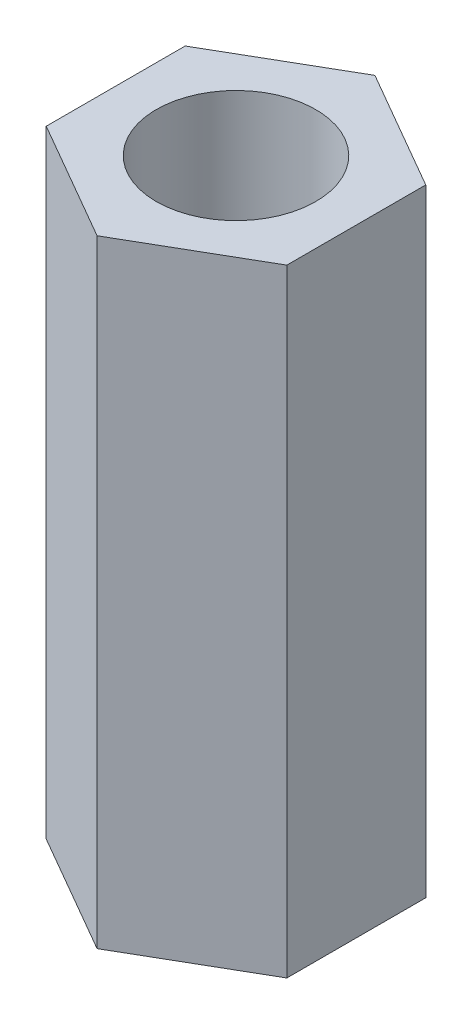
ISO-10303-21;
HEADER;
FILE_DESCRIPTION(('STEP AP214'),'2;1');
FILE_NAME('part.step','',(''),(''),'','','');
FILE_SCHEMA(('AUTOMOTIVE_DESIGN { 1 0 10303 214 1 1 1 1 }'));
ENDSEC;
DATA;
#1=APPLICATION_CONTEXT('core data for automotive mechanical design processes');
#2=APPLICATION_PROTOCOL_DEFINITION('international standard','automotive_design',2000,#1);
#3=PRODUCT_CONTEXT('',#1,'mechanical');
#4=PRODUCT('Part','Part','',(#3));
#5=PRODUCT_RELATED_PRODUCT_CATEGORY('part','',(#4));
#6=PRODUCT_DEFINITION_FORMATION('','',#4);
#7=PRODUCT_DEFINITION_CONTEXT('part definition',#1,'design');
#8=PRODUCT_DEFINITION('design','',#6,#7);
#9=PRODUCT_DEFINITION_SHAPE('','',#8);
#10=(LENGTH_UNIT() NAMED_UNIT(*) SI_UNIT(.MILLI.,.METRE.));
#11=(NAMED_UNIT(*) PLANE_ANGLE_UNIT() SI_UNIT($,.RADIAN.));
#12=(NAMED_UNIT(*) SI_UNIT($,.STERADIAN.) SOLID_ANGLE_UNIT());
#13=UNCERTAINTY_MEASURE_WITH_UNIT(LENGTH_MEASURE(1.E-05),#10,'distance_accuracy_value','');
#14=(GEOMETRIC_REPRESENTATION_CONTEXT(3) GLOBAL_UNCERTAINTY_ASSIGNED_CONTEXT((#13)) GLOBAL_UNIT_ASSIGNED_CONTEXT((#10,
#11,#12)) REPRESENTATION_CONTEXT('',''));
#15=CARTESIAN_POINT('',(0.,0.,0.));
#16=DIRECTION('',(0.,0.,1.));
#17=DIRECTION('',(1.,0.,0.));
#18=AXIS2_PLACEMENT_3D('',#15,#16,#17);
#19=CARTESIAN_POINT('',(0.,12.,0.));
#20=DIRECTION('',(0.,1.,0.));
#21=DIRECTION('',(0.,0.,1.));
#22=AXIS2_PLACEMENT_3D('',#19,#20,#21);
#23=PLANE('',#22);
#24=DIRECTION('',(-0.866025403784439,0.,-0.5));
#25=VECTOR('',#24,1.);
#26=CARTESIAN_POINT('',(2.33826859021798,12.,-1.35));
#27=LINE('',#26,#25);
#28=CARTESIAN_POINT('',(2.33826859021798,12.,-1.35));
#29=VERTEX_POINT('',#28);
#30=CARTESIAN_POINT('',(0.,12.,-2.7));
#31=VERTEX_POINT('',#30);
#32=EDGE_CURVE('E130',#29,#31,#27,.T.);
#33=ORIENTED_EDGE('',*,*,#32,.T.);
#34=DIRECTION('',(-0.866025403784439,0.,0.5));
#35=VECTOR('',#34,1.);
#36=CARTESIAN_POINT('',(0.,12.,-2.7));
#37=LINE('',#36,#35);
#38=CARTESIAN_POINT('',(-2.33826859021798,12.,-1.35));
#39=VERTEX_POINT('',#38);
#40=EDGE_CURVE('E88',#31,#39,#37,.T.);
#41=ORIENTED_EDGE('',*,*,#40,.T.);
#42=DIRECTION('',(0.,0.,1.));
#43=VECTOR('',#42,1.);
#44=CARTESIAN_POINT('',(-2.33826859021798,12.,-1.35));
#45=LINE('',#44,#43);
#46=CARTESIAN_POINT('',(-2.33826859021798,12.,1.35));
#47=VERTEX_POINT('',#46);
#48=EDGE_CURVE('E101',#39,#47,#45,.T.);
#49=ORIENTED_EDGE('',*,*,#48,.T.);
#50=DIRECTION('',(0.866025403784439,0.,0.5));
#51=VECTOR('',#50,1.);
#52=CARTESIAN_POINT('',(-2.33826859021798,12.,1.35));
#53=LINE('',#52,#51);
#54=CARTESIAN_POINT('',(0.,12.,2.7));
#55=VERTEX_POINT('',#54);
#56=EDGE_CURVE('E95',#47,#55,#53,.T.);
#57=ORIENTED_EDGE('',*,*,#56,.T.);
#58=DIRECTION('',(0.866025403784439,0.,-0.5));
#59=VECTOR('',#58,1.);
#60=CARTESIAN_POINT('',(0.,12.,2.7));
#61=LINE('',#60,#59);
#62=CARTESIAN_POINT('',(2.33826859021798,12.,1.35));
#63=VERTEX_POINT('',#62);
#64=EDGE_CURVE('E99',#55,#63,#61,.T.);
#65=ORIENTED_EDGE('',*,*,#64,.T.);
#66=DIRECTION('',(0.,0.,-1.));
#67=VECTOR('',#66,1.);
#68=CARTESIAN_POINT('',(2.33826859021798,12.,1.35));
#69=LINE('',#68,#67);
#70=EDGE_CURVE('E51',#63,#29,#69,.T.);
#71=ORIENTED_EDGE('',*,*,#70,.T.);
#72=EDGE_LOOP('',(#33,#41,#49,#57,#65,#71));
#73=FACE_BOUND('',#72,.T.);
#74=CARTESIAN_POINT('',(0.,12.,0.));
#75=DIRECTION('',(0.,1.,0.));
#76=DIRECTION('',(0.,0.,1.));
#77=AXIS2_PLACEMENT_3D('',#74,#75,#76);
#78=CIRCLE('',#77,1.55);
#79=CARTESIAN_POINT('',(0.,12.,1.55));
#80=VERTEX_POINT('',#79);
#81=EDGE_CURVE('E123',#80,#80,#78,.T.);
#82=ORIENTED_EDGE('',*,*,#81,.F.);
#83=EDGE_LOOP('',(#82));
#84=FACE_BOUND('',#83,.T.);
#85=ADVANCED_FACE('F34',(#73,#84),#23,.T.);
#86=CARTESIAN_POINT('',(0.,0.,0.));
#87=DIRECTION('',(0.,1.,0.));
#88=DIRECTION('',(0.,0.,1.));
#89=AXIS2_PLACEMENT_3D('',#86,#87,#88);
#90=PLANE('',#89);
#91=DIRECTION('',(-0.866025403784439,0.,-0.5));
#92=VECTOR('',#91,1.);
#93=CARTESIAN_POINT('',(2.33826859021798,0.,-1.35));
#94=LINE('',#93,#92);
#95=CARTESIAN_POINT('',(2.33826859021798,0.,-1.35));
#96=VERTEX_POINT('',#95);
#97=CARTESIAN_POINT('',(0.,0.,-2.7));
#98=VERTEX_POINT('',#97);
#99=EDGE_CURVE('E119',#96,#98,#94,.T.);
#100=ORIENTED_EDGE('',*,*,#99,.F.);
#101=DIRECTION('',(0.,0.,-1.));
#102=VECTOR('',#101,1.);
#103=CARTESIAN_POINT('',(2.33826859021798,0.,1.35));
#104=LINE('',#103,#102);
#105=CARTESIAN_POINT('',(2.33826859021798,0.,1.35));
#106=VERTEX_POINT('',#105);
#107=EDGE_CURVE('E80',#106,#96,#104,.T.);
#108=ORIENTED_EDGE('',*,*,#107,.F.);
#109=DIRECTION('',(0.866025403784439,0.,-0.5));
#110=VECTOR('',#109,1.);
#111=CARTESIAN_POINT('',(0.,0.,2.7));
#112=LINE('',#111,#110);
#113=CARTESIAN_POINT('',(0.,0.,2.7));
#114=VERTEX_POINT('',#113);
#115=EDGE_CURVE('E74',#114,#106,#112,.T.);
#116=ORIENTED_EDGE('',*,*,#115,.F.);
#117=DIRECTION('',(0.866025403784439,0.,0.5));
#118=VECTOR('',#117,1.);
#119=CARTESIAN_POINT('',(-2.33826859021798,0.,1.35));
#120=LINE('',#119,#118);
#121=CARTESIAN_POINT('',(-2.33826859021798,0.,1.35));
#122=VERTEX_POINT('',#121);
#123=EDGE_CURVE('E109',#122,#114,#120,.T.);
#124=ORIENTED_EDGE('',*,*,#123,.F.);
#125=DIRECTION('',(0.,0.,1.));
#126=VECTOR('',#125,1.);
#127=CARTESIAN_POINT('',(-2.33826859021798,0.,-1.35));
#128=LINE('',#127,#126);
#129=CARTESIAN_POINT('',(-2.33826859021798,0.,-1.35));
#130=VERTEX_POINT('',#129);
#131=EDGE_CURVE('E125',#130,#122,#128,.T.);
#132=ORIENTED_EDGE('',*,*,#131,.F.);
#133=DIRECTION('',(-0.866025403784439,0.,0.5));
#134=VECTOR('',#133,1.);
#135=CARTESIAN_POINT('',(0.,0.,-2.7));
#136=LINE('',#135,#134);
#137=EDGE_CURVE('E122',#98,#130,#136,.T.);
#138=ORIENTED_EDGE('',*,*,#137,.F.);
#139=EDGE_LOOP('',(#100,#108,#116,#124,#132,#138));
#140=FACE_BOUND('',#139,.T.);
#141=CARTESIAN_POINT('',(0.,0.,0.));
#142=DIRECTION('',(0.,1.,0.));
#143=DIRECTION('',(0.,0.,1.));
#144=AXIS2_PLACEMENT_3D('',#141,#142,#143);
#145=CIRCLE('',#144,1.55);
#146=CARTESIAN_POINT('',(0.,0.,1.55));
#147=VERTEX_POINT('',#146);
#148=EDGE_CURVE('E223',#147,#147,#145,.T.);
#149=ORIENTED_EDGE('',*,*,#148,.T.);
#150=EDGE_LOOP('',(#149));
#151=FACE_BOUND('',#150,.T.);
#152=ADVANCED_FACE('F139',(#140,#151),#90,.F.);
#153=CARTESIAN_POINT('',(2.33826859021798,12.,-1.35));
#154=DIRECTION('',(-0.5,0.,0.866025403784439));
#155=DIRECTION('',(0.866025403784439,0.,0.5));
#156=AXIS2_PLACEMENT_3D('',#153,#154,#155);
#157=PLANE('',#156);
#158=ORIENTED_EDGE('',*,*,#99,.T.);
#159=DIRECTION('',(0.,-1.,0.));
#160=VECTOR('',#159,1.);
#161=CARTESIAN_POINT('',(0.,12.,-2.7));
#162=LINE('',#161,#160);
#163=EDGE_CURVE('E11',#31,#98,#162,.T.);
#164=ORIENTED_EDGE('',*,*,#163,.F.);
#165=ORIENTED_EDGE('',*,*,#32,.F.);
#166=DIRECTION('',(0.,-1.,0.));
#167=VECTOR('',#166,1.);
#168=CARTESIAN_POINT('',(2.33826859021798,12.,-1.35));
#169=LINE('',#168,#167);
#170=EDGE_CURVE('E115',#29,#96,#169,.T.);
#171=ORIENTED_EDGE('',*,*,#170,.T.);
#172=EDGE_LOOP('',(#158,#164,#165,#171));
#173=FACE_BOUND('',#172,.T.);
#174=ADVANCED_FACE('F36',(#173),#157,.F.);
#175=CARTESIAN_POINT('',(0.,12.,-2.7));
#176=DIRECTION('',(0.5,0.,0.866025403784438));
#177=DIRECTION('',(0.866025403784439,0.,-0.5));
#178=AXIS2_PLACEMENT_3D('',#175,#176,#177);
#179=PLANE('',#178);
#180=ORIENTED_EDGE('',*,*,#137,.T.);
#181=DIRECTION('',(0.,-1.,0.));
#182=VECTOR('',#181,1.);
#183=CARTESIAN_POINT('',(-2.33826859021798,12.,-1.35));
#184=LINE('',#183,#182);
#185=EDGE_CURVE('E43',#39,#130,#184,.T.);
#186=ORIENTED_EDGE('',*,*,#185,.F.);
#187=ORIENTED_EDGE('',*,*,#40,.F.);
#188=ORIENTED_EDGE('',*,*,#163,.T.);
#189=EDGE_LOOP('',(#180,#186,#187,#188));
#190=FACE_BOUND('',#189,.T.);
#191=ADVANCED_FACE('F164',(#190),#179,.F.);
#192=CARTESIAN_POINT('',(-2.33826859021798,12.,-1.35));
#193=DIRECTION('',(1.,0.,0.));
#194=DIRECTION('',(0.,0.,-1.));
#195=AXIS2_PLACEMENT_3D('',#192,#193,#194);
#196=PLANE('',#195);
#197=ORIENTED_EDGE('',*,*,#131,.T.);
#198=DIRECTION('',(0.,-1.,0.));
#199=VECTOR('',#198,1.);
#200=CARTESIAN_POINT('',(-2.33826859021798,12.,1.35));
#201=LINE('',#200,#199);
#202=EDGE_CURVE('E110',#47,#122,#201,.T.);
#203=ORIENTED_EDGE('',*,*,#202,.F.);
#204=ORIENTED_EDGE('',*,*,#48,.F.);
#205=ORIENTED_EDGE('',*,*,#185,.T.);
#206=EDGE_LOOP('',(#197,#203,#204,#205));
#207=FACE_BOUND('',#206,.T.);
#208=ADVANCED_FACE('F136',(#207),#196,.F.);
#209=CARTESIAN_POINT('',(-2.33826859021798,12.,1.35));
#210=DIRECTION('',(0.5,0.,-0.866025403784439));
#211=DIRECTION('',(-0.866025403784439,0.,-0.5));
#212=AXIS2_PLACEMENT_3D('',#209,#210,#211);
#213=PLANE('',#212);
#214=ORIENTED_EDGE('',*,*,#123,.T.);
#215=DIRECTION('',(0.,-1.,0.));
#216=VECTOR('',#215,1.);
#217=CARTESIAN_POINT('',(0.,12.,2.7));
#218=LINE('',#217,#216);
#219=EDGE_CURVE('E106',#55,#114,#218,.T.);
#220=ORIENTED_EDGE('',*,*,#219,.F.);
#221=ORIENTED_EDGE('',*,*,#56,.F.);
#222=ORIENTED_EDGE('',*,*,#202,.T.);
#223=EDGE_LOOP('',(#214,#220,#221,#222));
#224=FACE_BOUND('',#223,.T.);
#225=ADVANCED_FACE('F107',(#224),#213,.F.);
#226=CARTESIAN_POINT('',(0.,12.,2.7));
#227=DIRECTION('',(-0.5,0.,-0.866025403784439));
#228=DIRECTION('',(-0.866025403784439,0.,0.5));
#229=AXIS2_PLACEMENT_3D('',#226,#227,#228);
#230=PLANE('',#229);
#231=ORIENTED_EDGE('',*,*,#115,.T.);
#232=DIRECTION('',(0.,-1.,0.));
#233=VECTOR('',#232,1.);
#234=CARTESIAN_POINT('',(2.33826859021798,12.,1.35));
#235=LINE('',#234,#233);
#236=EDGE_CURVE('E111',#63,#106,#235,.T.);
#237=ORIENTED_EDGE('',*,*,#236,.F.);
#238=ORIENTED_EDGE('',*,*,#64,.F.);
#239=ORIENTED_EDGE('',*,*,#219,.T.);
#240=EDGE_LOOP('',(#231,#237,#238,#239));
#241=FACE_BOUND('',#240,.T.);
#242=ADVANCED_FACE('F113',(#241),#230,.F.);
#243=CARTESIAN_POINT('',(2.33826859021798,12.,1.35));
#244=DIRECTION('',(-1.,0.,0.));
#245=DIRECTION('',(0.,0.,1.));
#246=AXIS2_PLACEMENT_3D('',#243,#244,#245);
#247=PLANE('',#246);
#248=ORIENTED_EDGE('',*,*,#107,.T.);
#249=ORIENTED_EDGE('',*,*,#170,.F.);
#250=ORIENTED_EDGE('',*,*,#70,.F.);
#251=ORIENTED_EDGE('',*,*,#236,.T.);
#252=EDGE_LOOP('',(#248,#249,#250,#251));
#253=FACE_BOUND('',#252,.T.);
#254=ADVANCED_FACE('F144',(#253),#247,.F.);
#255=CARTESIAN_POINT('',(0.,12.,0.));
#256=DIRECTION('',(0.,-1.,0.));
#257=DIRECTION('',(0.,0.,-1.));
#258=AXIS2_PLACEMENT_3D('',#255,#256,#257);
#259=CYLINDRICAL_SURFACE('',#258,1.55);
#260=ORIENTED_EDGE('',*,*,#81,.T.);
#261=EDGE_LOOP('',(#260));
#262=FACE_BOUND('',#261,.T.);
#263=ORIENTED_EDGE('',*,*,#148,.F.);
#264=EDGE_LOOP('',(#263));
#265=FACE_BOUND('',#264,.T.);
#266=ADVANCED_FACE('F146',(#262,#265),#259,.F.);
#267=CLOSED_SHELL('',(#85,#152,#174,#191,#208,#225,#242,#254,#266));
#268=MANIFOLD_SOLID_BREP('B2',#267);
#269=ADVANCED_BREP_SHAPE_REPRESENTATION('',(#18,#268),#14);
#270=SHAPE_DEFINITION_REPRESENTATION(#9,#269);
ENDSEC;
END-ISO-10303-21;
